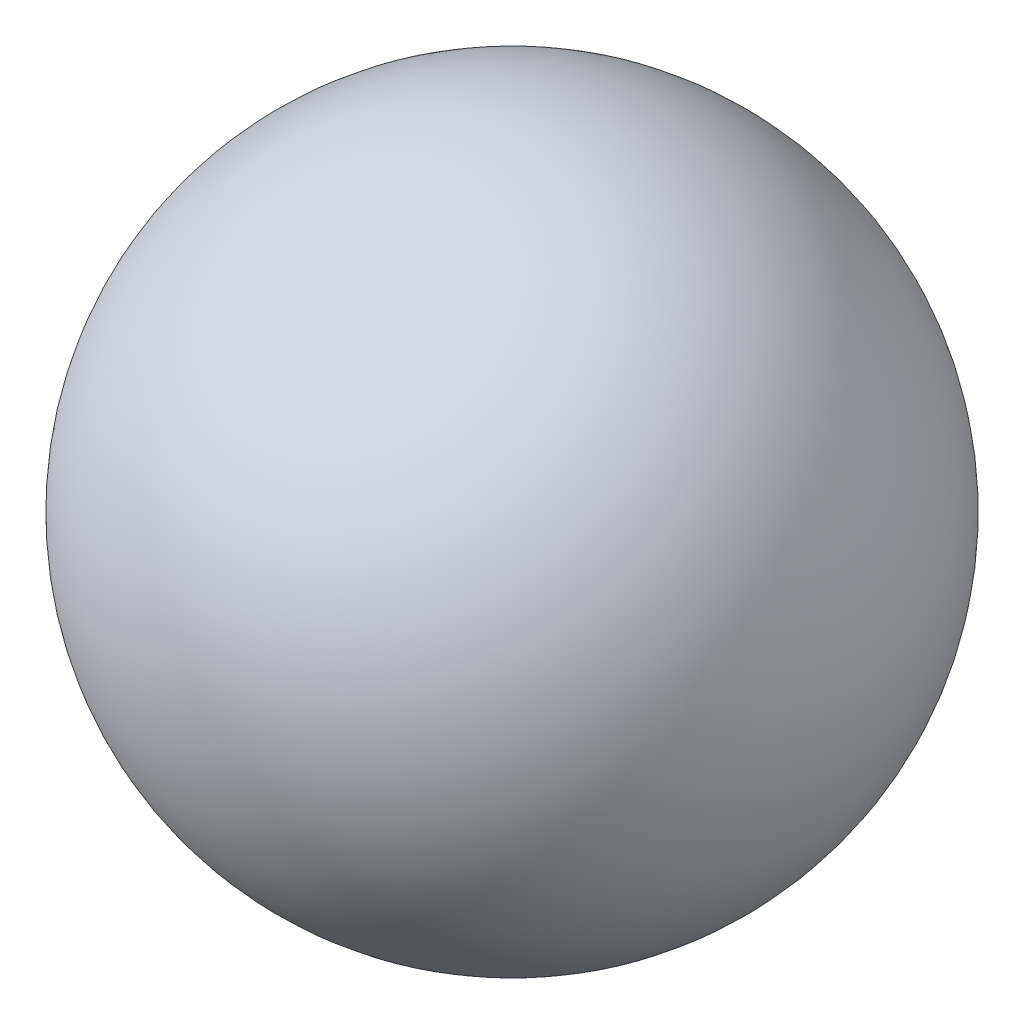
ISO-10303-21;
HEADER;
FILE_DESCRIPTION(('STEP AP214'),'2;1');
FILE_NAME('part.step','',(''),(''),'','','');
FILE_SCHEMA(('AUTOMOTIVE_DESIGN { 1 0 10303 214 1 1 1 1 }'));
ENDSEC;
DATA;
#1=APPLICATION_CONTEXT('core data for automotive mechanical design processes');
#2=APPLICATION_PROTOCOL_DEFINITION('international standard','automotive_design',2000,#1);
#3=PRODUCT_CONTEXT('',#1,'mechanical');
#4=PRODUCT('Part','Part','',(#3));
#5=PRODUCT_RELATED_PRODUCT_CATEGORY('part','',(#4));
#6=PRODUCT_DEFINITION_FORMATION('','',#4);
#7=PRODUCT_DEFINITION_CONTEXT('part definition',#1,'design');
#8=PRODUCT_DEFINITION('design','',#6,#7);
#9=PRODUCT_DEFINITION_SHAPE('','',#8);
#10=(LENGTH_UNIT() NAMED_UNIT(*) SI_UNIT(.MILLI.,.METRE.));
#11=(NAMED_UNIT(*) PLANE_ANGLE_UNIT() SI_UNIT($,.RADIAN.));
#12=(NAMED_UNIT(*) SI_UNIT($,.STERADIAN.) SOLID_ANGLE_UNIT());
#13=UNCERTAINTY_MEASURE_WITH_UNIT(LENGTH_MEASURE(1.E-05),#10,'distance_accuracy_value','');
#14=(GEOMETRIC_REPRESENTATION_CONTEXT(3) GLOBAL_UNCERTAINTY_ASSIGNED_CONTEXT((#13)) GLOBAL_UNIT_ASSIGNED_CONTEXT((#10,
#11,#12)) REPRESENTATION_CONTEXT('',''));
#15=CARTESIAN_POINT('',(0.,0.,0.));
#16=DIRECTION('',(0.,0.,1.));
#17=DIRECTION('',(1.,0.,0.));
#18=AXIS2_PLACEMENT_3D('',#15,#16,#17);
#19=CARTESIAN_POINT('',(0.,0.,0.));
#20=DIRECTION('',(0.,1.,0.));
#21=DIRECTION('',(1.,0.,0.));
#22=AXIS2_PLACEMENT_3D('',#19,#20,#21);
#23=SPHERICAL_SURFACE('',#22,11.5);
#24=CARTESIAN_POINT('',(0.,11.5,0.));
#25=VERTEX_POINT('',#24);
#26=VERTEX_LOOP('',#25);
#27=FACE_BOUND('',#26,.T.);
#28=ADVANCED_FACE('F39',(#27),#23,.T.);
#29=CLOSED_SHELL('',(#28));
#30=MANIFOLD_SOLID_BREP('B2',#29);
#31=ADVANCED_BREP_SHAPE_REPRESENTATION('',(#18,#30),#14);
#32=SHAPE_DEFINITION_REPRESENTATION(#9,#31);
ENDSEC;
END-ISO-10303-21;
